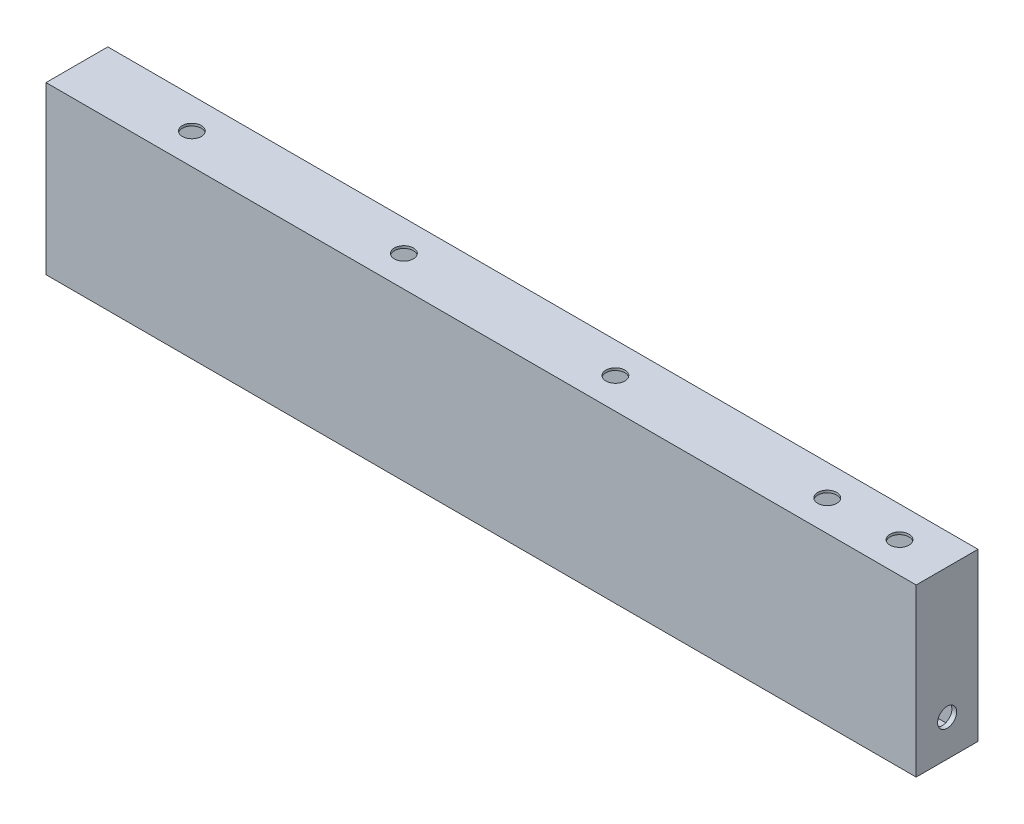
ISO-10303-21;
HEADER;
FILE_DESCRIPTION(('STEP AP214'),'2;1');
FILE_NAME('part.step','',(''),(''),'','','');
FILE_SCHEMA(('AUTOMOTIVE_DESIGN { 1 0 10303 214 1 1 1 1 }'));
ENDSEC;
DATA;
#1=APPLICATION_CONTEXT('core data for automotive mechanical design processes');
#2=APPLICATION_PROTOCOL_DEFINITION('international standard','automotive_design',2000,#1);
#3=PRODUCT_CONTEXT('',#1,'mechanical');
#4=PRODUCT('Part','Part','',(#3));
#5=PRODUCT_RELATED_PRODUCT_CATEGORY('part','',(#4));
#6=PRODUCT_DEFINITION_FORMATION('','',#4);
#7=PRODUCT_DEFINITION_CONTEXT('part definition',#1,'design');
#8=PRODUCT_DEFINITION('design','',#6,#7);
#9=PRODUCT_DEFINITION_SHAPE('','',#8);
#10=(LENGTH_UNIT() NAMED_UNIT(*) SI_UNIT(.MILLI.,.METRE.));
#11=(NAMED_UNIT(*) PLANE_ANGLE_UNIT() SI_UNIT($,.RADIAN.));
#12=(NAMED_UNIT(*) SI_UNIT($,.STERADIAN.) SOLID_ANGLE_UNIT());
#13=UNCERTAINTY_MEASURE_WITH_UNIT(LENGTH_MEASURE(1.E-05),#10,'distance_accuracy_value','');
#14=(GEOMETRIC_REPRESENTATION_CONTEXT(3) GLOBAL_UNCERTAINTY_ASSIGNED_CONTEXT((#13)) GLOBAL_UNIT_ASSIGNED_CONTEXT((#10,
#11,#12)) REPRESENTATION_CONTEXT('',''));
#15=CARTESIAN_POINT('',(0.,0.,0.));
#16=DIRECTION('',(0.,0.,1.));
#17=DIRECTION('',(1.,0.,0.));
#18=AXIS2_PLACEMENT_3D('',#15,#16,#17);
#19=CARTESIAN_POINT('',(905.,175.,-65.));
#20=DIRECTION('',(-1.,0.,0.));
#21=DIRECTION('',(0.,0.,1.));
#22=AXIS2_PLACEMENT_3D('',#19,#20,#21);
#23=PLANE('',#22);
#24=CARTESIAN_POINT('',(905.,-98.5,-0.0999999999999751));
#25=DIRECTION('',(-1.,0.,0.));
#26=DIRECTION('',(0.,0.,1.));
#27=AXIS2_PLACEMENT_3D('',#24,#25,#26);
#28=CIRCLE('',#27,20.);
#29=CARTESIAN_POINT('',(905.,-98.5,19.9));
#30=VERTEX_POINT('',#29);
#31=EDGE_CURVE('E413',#30,#30,#28,.T.);
#32=ORIENTED_EDGE('',*,*,#31,.F.);
#33=EDGE_LOOP('',(#32));
#34=FACE_BOUND('',#33,.T.);
#35=DIRECTION('',(0.,0.,-1.));
#36=VECTOR('',#35,1.);
#37=CARTESIAN_POINT('',(905.,-165.,-65.));
#38=LINE('',#37,#36);
#39=CARTESIAN_POINT('',(905.,-165.,55.));
#40=VERTEX_POINT('',#39);
#41=CARTESIAN_POINT('',(905.,-165.,-55.));
#42=VERTEX_POINT('',#41);
#43=EDGE_CURVE('E169',#40,#42,#38,.T.);
#44=ORIENTED_EDGE('',*,*,#43,.F.);
#45=DIRECTION('',(0.,-1.,0.));
#46=VECTOR('',#45,1.);
#47=CARTESIAN_POINT('',(905.,175.,55.));
#48=LINE('',#47,#46);
#49=CARTESIAN_POINT('',(905.,170.,55.));
#50=VERTEX_POINT('',#49);
#51=EDGE_CURVE('E259',#50,#40,#48,.T.);
#52=ORIENTED_EDGE('',*,*,#51,.F.);
#53=DIRECTION('',(0.,0.,-1.));
#54=VECTOR('',#53,1.);
#55=CARTESIAN_POINT('',(905.,170.,-65.));
#56=LINE('',#55,#54);
#57=CARTESIAN_POINT('',(905.,170.,-55.));
#58=VERTEX_POINT('',#57);
#59=EDGE_CURVE('E238',#50,#58,#56,.T.);
#60=ORIENTED_EDGE('',*,*,#59,.T.);
#61=DIRECTION('',(0.,-1.,0.));
#62=VECTOR('',#61,1.);
#63=CARTESIAN_POINT('',(905.,175.,-55.));
#64=LINE('',#63,#62);
#65=EDGE_CURVE('E254',#58,#42,#64,.T.);
#66=ORIENTED_EDGE('',*,*,#65,.T.);
#67=EDGE_LOOP('',(#44,#52,#60,#66));
#68=FACE_BOUND('',#67,.T.);
#69=ADVANCED_FACE('F42',(#34,#68),#23,.T.);
#70=CARTESIAN_POINT('',(-915.,175.,-55.));
#71=DIRECTION('',(0.,0.,1.));
#72=DIRECTION('',(1.,0.,0.));
#73=AXIS2_PLACEMENT_3D('',#70,#71,#72);
#74=PLANE('',#73);
#75=CARTESIAN_POINT('',(699.9,80.,-55.));
#76=DIRECTION('',(0.,0.,1.));
#77=DIRECTION('',(1.,0.,0.));
#78=AXIS2_PLACEMENT_3D('',#75,#76,#77);
#79=CIRCLE('',#78,22.7500000000003);
#80=CARTESIAN_POINT('',(722.65,80.,-55.));
#81=VERTEX_POINT('',#80);
#82=EDGE_CURVE('E53',#81,#81,#79,.F.);
#83=ORIENTED_EDGE('',*,*,#82,.T.);
#84=EDGE_LOOP('',(#83));
#85=FACE_BOUND('',#84,.T.);
#86=CARTESIAN_POINT('',(619.9,80.,-55.));
#87=DIRECTION('',(0.,0.,1.));
#88=DIRECTION('',(1.,0.,0.));
#89=AXIS2_PLACEMENT_3D('',#86,#87,#88);
#90=CIRCLE('',#89,22.7500000000003);
#91=CARTESIAN_POINT('',(642.650000000001,80.,-55.));
#92=VERTEX_POINT('',#91);
#93=EDGE_CURVE('E178',#92,#92,#90,.F.);
#94=ORIENTED_EDGE('',*,*,#93,.T.);
#95=EDGE_LOOP('',(#94));
#96=FACE_BOUND('',#95,.T.);
#97=CARTESIAN_POINT('',(259.9,80.,-55.));
#98=DIRECTION('',(0.,0.,1.));
#99=DIRECTION('',(1.,0.,0.));
#100=AXIS2_PLACEMENT_3D('',#97,#98,#99);
#101=CIRCLE('',#100,22.75);
#102=CARTESIAN_POINT('',(282.65,80.,-55.));
#103=VERTEX_POINT('',#102);
#104=EDGE_CURVE('E186',#103,#103,#101,.F.);
#105=ORIENTED_EDGE('',*,*,#104,.T.);
#106=EDGE_LOOP('',(#105));
#107=FACE_BOUND('',#106,.T.);
#108=CARTESIAN_POINT('',(179.9,80.,-55.));
#109=DIRECTION('',(0.,0.,1.));
#110=DIRECTION('',(1.,0.,0.));
#111=AXIS2_PLACEMENT_3D('',#108,#109,#110);
#112=CIRCLE('',#111,22.75);
#113=CARTESIAN_POINT('',(202.65,80.,-55.));
#114=VERTEX_POINT('',#113);
#115=EDGE_CURVE('E194',#114,#114,#112,.F.);
#116=ORIENTED_EDGE('',*,*,#115,.T.);
#117=EDGE_LOOP('',(#116));
#118=FACE_BOUND('',#117,.T.);
#119=CARTESIAN_POINT('',(-180.1,80.,-55.));
#120=DIRECTION('',(0.,0.,1.));
#121=DIRECTION('',(1.,0.,0.));
#122=AXIS2_PLACEMENT_3D('',#119,#120,#121);
#123=CIRCLE('',#122,22.75);
#124=CARTESIAN_POINT('',(-157.35,80.,-55.));
#125=VERTEX_POINT('',#124);
#126=EDGE_CURVE('E202',#125,#125,#123,.F.);
#127=ORIENTED_EDGE('',*,*,#126,.T.);
#128=EDGE_LOOP('',(#127));
#129=FACE_BOUND('',#128,.T.);
#130=CARTESIAN_POINT('',(-260.1,80.,-55.));
#131=DIRECTION('',(0.,0.,1.));
#132=DIRECTION('',(1.,0.,0.));
#133=AXIS2_PLACEMENT_3D('',#130,#131,#132);
#134=CIRCLE('',#133,22.75);
#135=CARTESIAN_POINT('',(-237.35,80.,-55.));
#136=VERTEX_POINT('',#135);
#137=EDGE_CURVE('E210',#136,#136,#134,.F.);
#138=ORIENTED_EDGE('',*,*,#137,.T.);
#139=EDGE_LOOP('',(#138));
#140=FACE_BOUND('',#139,.T.);
#141=CARTESIAN_POINT('',(-620.1,80.,-55.));
#142=DIRECTION('',(0.,0.,1.));
#143=DIRECTION('',(1.,0.,0.));
#144=AXIS2_PLACEMENT_3D('',#141,#142,#143);
#145=CIRCLE('',#144,22.75);
#146=CARTESIAN_POINT('',(-597.35,80.,-55.));
#147=VERTEX_POINT('',#146);
#148=EDGE_CURVE('E218',#147,#147,#145,.F.);
#149=ORIENTED_EDGE('',*,*,#148,.T.);
#150=EDGE_LOOP('',(#149));
#151=FACE_BOUND('',#150,.T.);
#152=CARTESIAN_POINT('',(-700.1,80.,-55.));
#153=DIRECTION('',(0.,0.,1.));
#154=DIRECTION('',(1.,0.,0.));
#155=AXIS2_PLACEMENT_3D('',#152,#153,#154);
#156=CIRCLE('',#155,22.75);
#157=CARTESIAN_POINT('',(-677.35,80.,-55.));
#158=VERTEX_POINT('',#157);
#159=EDGE_CURVE('E226',#158,#158,#156,.F.);
#160=ORIENTED_EDGE('',*,*,#159,.T.);
#161=EDGE_LOOP('',(#160));
#162=FACE_BOUND('',#161,.T.);
#163=DIRECTION('',(-1.,0.,0.));
#164=VECTOR('',#163,1.);
#165=CARTESIAN_POINT('',(-915.,-165.,-55.));
#166=LINE('',#165,#164);
#167=CARTESIAN_POINT('',(-905.,-165.,-55.));
#168=VERTEX_POINT('',#167);
#169=EDGE_CURVE('E62',#42,#168,#166,.T.);
#170=ORIENTED_EDGE('',*,*,#169,.F.);
#171=ORIENTED_EDGE('',*,*,#65,.F.);
#172=DIRECTION('',(-1.,0.,0.));
#173=VECTOR('',#172,1.);
#174=CARTESIAN_POINT('',(-915.,170.,-55.));
#175=LINE('',#174,#173);
#176=CARTESIAN_POINT('',(-905.,170.,-55.));
#177=VERTEX_POINT('',#176);
#178=EDGE_CURVE('E86',#58,#177,#175,.T.);
#179=ORIENTED_EDGE('',*,*,#178,.T.);
#180=DIRECTION('',(0.,-1.,0.));
#181=VECTOR('',#180,1.);
#182=CARTESIAN_POINT('',(-905.,175.,-55.));
#183=LINE('',#182,#181);
#184=EDGE_CURVE('E248',#177,#168,#183,.T.);
#185=ORIENTED_EDGE('',*,*,#184,.T.);
#186=EDGE_LOOP('',(#170,#171,#179,#185));
#187=FACE_BOUND('',#186,.T.);
#188=ADVANCED_FACE('F268',(#85,#96,#107,#118,#129,#140,#151,#162,#187),#74,.T.);
#189=CARTESIAN_POINT('',(-905.,175.,-65.));
#190=DIRECTION('',(1.,0.,0.));
#191=DIRECTION('',(0.,0.,-1.));
#192=AXIS2_PLACEMENT_3D('',#189,#190,#191);
#193=PLANE('',#192);
#194=CARTESIAN_POINT('',(-905.,-50.,0.));
#195=DIRECTION('',(1.,0.,0.));
#196=DIRECTION('',(0.,0.,-1.));
#197=AXIS2_PLACEMENT_3D('',#194,#195,#196);
#198=CIRCLE('',#197,20.);
#199=CARTESIAN_POINT('',(-905.,-50.,-20.));
#200=VERTEX_POINT('',#199);
#201=EDGE_CURVE('E458',#200,#200,#198,.T.);
#202=ORIENTED_EDGE('',*,*,#201,.F.);
#203=EDGE_LOOP('',(#202));
#204=FACE_BOUND('',#203,.T.);
#205=DIRECTION('',(0.,0.,1.));
#206=VECTOR('',#205,1.);
#207=CARTESIAN_POINT('',(-905.,-165.,-65.));
#208=LINE('',#207,#206);
#209=CARTESIAN_POINT('',(-905.,-165.,55.));
#210=VERTEX_POINT('',#209);
#211=EDGE_CURVE('E251',#168,#210,#208,.T.);
#212=ORIENTED_EDGE('',*,*,#211,.F.);
#213=ORIENTED_EDGE('',*,*,#184,.F.);
#214=DIRECTION('',(0.,0.,1.));
#215=VECTOR('',#214,1.);
#216=CARTESIAN_POINT('',(-905.,170.,-65.));
#217=LINE('',#216,#215);
#218=CARTESIAN_POINT('',(-905.,170.,55.));
#219=VERTEX_POINT('',#218);
#220=EDGE_CURVE('E233',#177,#219,#217,.T.);
#221=ORIENTED_EDGE('',*,*,#220,.T.);
#222=DIRECTION('',(0.,-1.,0.));
#223=VECTOR('',#222,1.);
#224=CARTESIAN_POINT('',(-905.,175.,55.));
#225=LINE('',#224,#223);
#226=EDGE_CURVE('E241',#219,#210,#225,.T.);
#227=ORIENTED_EDGE('',*,*,#226,.T.);
#228=EDGE_LOOP('',(#212,#213,#221,#227));
#229=FACE_BOUND('',#228,.T.);
#230=ADVANCED_FACE('F272',(#204,#229),#193,.T.);
#231=CARTESIAN_POINT('',(-915.,175.,55.));
#232=DIRECTION('',(0.,0.,-1.));
#233=DIRECTION('',(-1.,0.,0.));
#234=AXIS2_PLACEMENT_3D('',#231,#232,#233);
#235=PLANE('',#234);
#236=DIRECTION('',(1.,0.,0.));
#237=VECTOR('',#236,1.);
#238=CARTESIAN_POINT('',(-915.,-165.,55.));
#239=LINE('',#238,#237);
#240=EDGE_CURVE('E245',#210,#40,#239,.T.);
#241=ORIENTED_EDGE('',*,*,#240,.F.);
#242=ORIENTED_EDGE('',*,*,#226,.F.);
#243=DIRECTION('',(1.,0.,0.));
#244=VECTOR('',#243,1.);
#245=CARTESIAN_POINT('',(-915.,170.,55.));
#246=LINE('',#245,#244);
#247=EDGE_CURVE('E230',#219,#50,#246,.T.);
#248=ORIENTED_EDGE('',*,*,#247,.T.);
#249=ORIENTED_EDGE('',*,*,#51,.T.);
#250=EDGE_LOOP('',(#241,#242,#248,#249));
#251=FACE_BOUND('',#250,.T.);
#252=ADVANCED_FACE('F277',(#251),#235,.T.);
#253=CARTESIAN_POINT('',(0.,170.,0.));
#254=DIRECTION('',(0.,1.,0.));
#255=DIRECTION('',(0.,0.,1.));
#256=AXIS2_PLACEMENT_3D('',#253,#254,#255);
#257=PLANE('',#256);
#258=CARTESIAN_POINT('',(662.9,170.,-0.100000000000182));
#259=DIRECTION('',(0.,1.,0.));
#260=DIRECTION('',(0.,0.,1.));
#261=AXIS2_PLACEMENT_3D('',#258,#259,#260);
#262=CIRCLE('',#261,20.);
#263=CARTESIAN_POINT('',(662.9,170.,19.8999999999998));
#264=VERTEX_POINT('',#263);
#265=EDGE_CURVE('E450',#264,#264,#262,.T.);
#266=ORIENTED_EDGE('',*,*,#265,.T.);
#267=EDGE_LOOP('',(#266));
#268=FACE_BOUND('',#267,.T.);
#269=CARTESIAN_POINT('',(217.3,170.,-0.100000000000128));
#270=DIRECTION('',(0.,1.,0.));
#271=DIRECTION('',(0.,0.,1.));
#272=AXIS2_PLACEMENT_3D('',#269,#270,#271);
#273=CIRCLE('',#272,20.);
#274=CARTESIAN_POINT('',(217.3,170.,19.8999999999999));
#275=VERTEX_POINT('',#274);
#276=EDGE_CURVE('E446',#275,#275,#273,.T.);
#277=ORIENTED_EDGE('',*,*,#276,.T.);
#278=EDGE_LOOP('',(#277));
#279=FACE_BOUND('',#278,.T.);
#280=CARTESIAN_POINT('',(-227.5,170.,-0.100000000000073));
#281=DIRECTION('',(0.,1.,0.));
#282=DIRECTION('',(0.,0.,1.));
#283=AXIS2_PLACEMENT_3D('',#280,#281,#282);
#284=CIRCLE('',#283,20.);
#285=CARTESIAN_POINT('',(-227.5,170.,19.8999999999999));
#286=VERTEX_POINT('',#285);
#287=EDGE_CURVE('E442',#286,#286,#284,.T.);
#288=ORIENTED_EDGE('',*,*,#287,.T.);
#289=EDGE_LOOP('',(#288));
#290=FACE_BOUND('',#289,.T.);
#291=CARTESIAN_POINT('',(-673.4,170.,-0.100000000000019));
#292=DIRECTION('',(0.,1.,0.));
#293=DIRECTION('',(0.,0.,1.));
#294=AXIS2_PLACEMENT_3D('',#291,#292,#293);
#295=CIRCLE('',#294,20.);
#296=CARTESIAN_POINT('',(-673.4,170.,19.8999999999999));
#297=VERTEX_POINT('',#296);
#298=EDGE_CURVE('E427',#297,#297,#295,.T.);
#299=ORIENTED_EDGE('',*,*,#298,.T.);
#300=EDGE_LOOP('',(#299));
#301=FACE_BOUND('',#300,.T.);
#302=CARTESIAN_POINT('',(815.,170.,0.));
#303=DIRECTION('',(0.,1.,0.));
#304=DIRECTION('',(0.,0.,1.));
#305=AXIS2_PLACEMENT_3D('',#302,#303,#304);
#306=CIRCLE('',#305,20.0000000000001);
#307=CARTESIAN_POINT('',(815.,170.,20.0000000000001));
#308=VERTEX_POINT('',#307);
#309=EDGE_CURVE('E46',#308,#308,#306,.T.);
#310=ORIENTED_EDGE('',*,*,#309,.T.);
#311=EDGE_LOOP('',(#310));
#312=FACE_BOUND('',#311,.T.);
#313=ORIENTED_EDGE('',*,*,#59,.F.);
#314=ORIENTED_EDGE('',*,*,#247,.F.);
#315=ORIENTED_EDGE('',*,*,#220,.F.);
#316=ORIENTED_EDGE('',*,*,#178,.F.);
#317=EDGE_LOOP('',(#313,#314,#315,#316));
#318=FACE_BOUND('',#317,.T.);
#319=ADVANCED_FACE('F275',(#268,#279,#290,#301,#312,#318),#257,.F.);
#320=CARTESIAN_POINT('',(0.,-165.,0.));
#321=DIRECTION('',(0.,1.,0.));
#322=DIRECTION('',(0.,0.,1.));
#323=AXIS2_PLACEMENT_3D('',#320,#321,#322);
#324=PLANE('',#323);
#325=ORIENTED_EDGE('',*,*,#43,.T.);
#326=ORIENTED_EDGE('',*,*,#169,.T.);
#327=ORIENTED_EDGE('',*,*,#211,.T.);
#328=ORIENTED_EDGE('',*,*,#240,.T.);
#329=EDGE_LOOP('',(#325,#326,#327,#328));
#330=FACE_BOUND('',#329,.T.);
#331=ADVANCED_FACE('F264',(#330),#324,.T.);
#332=CARTESIAN_POINT('',(-700.1,80.,-0.999999999999987));
#333=DIRECTION('',(0.,0.,-1.));
#334=DIRECTION('',(-1.,0.,0.));
#335=AXIS2_PLACEMENT_3D('',#332,#333,#334);
#336=CYLINDRICAL_SURFACE('',#335,22.75);
#337=CARTESIAN_POINT('',(-700.1,80.,9.00000000000001));
#338=DIRECTION('',(0.,0.,-1.));
#339=DIRECTION('',(-1.,0.,0.));
#340=AXIS2_PLACEMENT_3D('',#337,#338,#339);
#341=CIRCLE('',#340,22.75);
#342=CARTESIAN_POINT('',(-722.85,80.,9.00000000000001));
#343=VERTEX_POINT('',#342);
#344=EDGE_CURVE('E222',#343,#343,#341,.T.);
#345=ORIENTED_EDGE('',*,*,#344,.T.);
#346=EDGE_LOOP('',(#345));
#347=FACE_BOUND('',#346,.T.);
#348=ORIENTED_EDGE('',*,*,#159,.F.);
#349=EDGE_LOOP('',(#348));
#350=FACE_BOUND('',#349,.T.);
#351=ADVANCED_FACE('F821',(#347,#350),#336,.T.);
#352=CARTESIAN_POINT('',(-700.1,80.,9.00000000000001));
#353=DIRECTION('',(0.,0.,-1.));
#354=DIRECTION('',(-1.,0.,0.));
#355=AXIS2_PLACEMENT_3D('',#352,#353,#354);
#356=PLANE('',#355);
#357=ORIENTED_EDGE('',*,*,#344,.F.);
#358=EDGE_LOOP('',(#357));
#359=FACE_BOUND('',#358,.T.);
#360=ADVANCED_FACE('F813',(#359),#356,.F.);
#361=CARTESIAN_POINT('',(-620.1,80.,-0.999999999999987));
#362=DIRECTION('',(0.,0.,-1.));
#363=DIRECTION('',(-1.,0.,0.));
#364=AXIS2_PLACEMENT_3D('',#361,#362,#363);
#365=CYLINDRICAL_SURFACE('',#364,22.75);
#366=CARTESIAN_POINT('',(-620.1,80.,9.00000000000001));
#367=DIRECTION('',(0.,0.,-1.));
#368=DIRECTION('',(-1.,0.,0.));
#369=AXIS2_PLACEMENT_3D('',#366,#367,#368);
#370=CIRCLE('',#369,22.75);
#371=CARTESIAN_POINT('',(-642.85,80.,9.00000000000001));
#372=VERTEX_POINT('',#371);
#373=EDGE_CURVE('E214',#372,#372,#370,.T.);
#374=ORIENTED_EDGE('',*,*,#373,.T.);
#375=EDGE_LOOP('',(#374));
#376=FACE_BOUND('',#375,.T.);
#377=ORIENTED_EDGE('',*,*,#148,.F.);
#378=EDGE_LOOP('',(#377));
#379=FACE_BOUND('',#378,.T.);
#380=ADVANCED_FACE('F805',(#376,#379),#365,.T.);
#381=CARTESIAN_POINT('',(-620.1,80.,9.00000000000001));
#382=DIRECTION('',(0.,0.,-1.));
#383=DIRECTION('',(-1.,0.,0.));
#384=AXIS2_PLACEMENT_3D('',#381,#382,#383);
#385=PLANE('',#384);
#386=ORIENTED_EDGE('',*,*,#373,.F.);
#387=EDGE_LOOP('',(#386));
#388=FACE_BOUND('',#387,.T.);
#389=ADVANCED_FACE('F797',(#388),#385,.F.);
#390=CARTESIAN_POINT('',(-260.1,80.,-0.999999999999987));
#391=DIRECTION('',(0.,0.,-1.));
#392=DIRECTION('',(-1.,0.,0.));
#393=AXIS2_PLACEMENT_3D('',#390,#391,#392);
#394=CYLINDRICAL_SURFACE('',#393,22.75);
#395=CARTESIAN_POINT('',(-260.1,80.,9.00000000000001));
#396=DIRECTION('',(0.,0.,-1.));
#397=DIRECTION('',(-1.,0.,0.));
#398=AXIS2_PLACEMENT_3D('',#395,#396,#397);
#399=CIRCLE('',#398,22.75);
#400=CARTESIAN_POINT('',(-282.85,80.,9.00000000000001));
#401=VERTEX_POINT('',#400);
#402=EDGE_CURVE('E206',#401,#401,#399,.T.);
#403=ORIENTED_EDGE('',*,*,#402,.T.);
#404=EDGE_LOOP('',(#403));
#405=FACE_BOUND('',#404,.T.);
#406=ORIENTED_EDGE('',*,*,#137,.F.);
#407=EDGE_LOOP('',(#406));
#408=FACE_BOUND('',#407,.T.);
#409=ADVANCED_FACE('F789',(#405,#408),#394,.T.);
#410=CARTESIAN_POINT('',(-260.1,80.,9.00000000000001));
#411=DIRECTION('',(0.,0.,-1.));
#412=DIRECTION('',(-1.,0.,0.));
#413=AXIS2_PLACEMENT_3D('',#410,#411,#412);
#414=PLANE('',#413);
#415=ORIENTED_EDGE('',*,*,#402,.F.);
#416=EDGE_LOOP('',(#415));
#417=FACE_BOUND('',#416,.T.);
#418=ADVANCED_FACE('F781',(#417),#414,.F.);
#419=CARTESIAN_POINT('',(-180.1,80.,-0.999999999999987));
#420=DIRECTION('',(0.,0.,-1.));
#421=DIRECTION('',(-1.,0.,0.));
#422=AXIS2_PLACEMENT_3D('',#419,#420,#421);
#423=CYLINDRICAL_SURFACE('',#422,22.75);
#424=CARTESIAN_POINT('',(-180.1,80.,9.00000000000001));
#425=DIRECTION('',(0.,0.,-1.));
#426=DIRECTION('',(-1.,0.,0.));
#427=AXIS2_PLACEMENT_3D('',#424,#425,#426);
#428=CIRCLE('',#427,22.75);
#429=CARTESIAN_POINT('',(-202.85,80.,9.00000000000001));
#430=VERTEX_POINT('',#429);
#431=EDGE_CURVE('E198',#430,#430,#428,.T.);
#432=ORIENTED_EDGE('',*,*,#431,.T.);
#433=EDGE_LOOP('',(#432));
#434=FACE_BOUND('',#433,.T.);
#435=ORIENTED_EDGE('',*,*,#126,.F.);
#436=EDGE_LOOP('',(#435));
#437=FACE_BOUND('',#436,.T.);
#438=ADVANCED_FACE('F773',(#434,#437),#423,.T.);
#439=CARTESIAN_POINT('',(-180.1,80.,9.00000000000001));
#440=DIRECTION('',(0.,0.,-1.));
#441=DIRECTION('',(-1.,0.,0.));
#442=AXIS2_PLACEMENT_3D('',#439,#440,#441);
#443=PLANE('',#442);
#444=ORIENTED_EDGE('',*,*,#431,.F.);
#445=EDGE_LOOP('',(#444));
#446=FACE_BOUND('',#445,.T.);
#447=ADVANCED_FACE('F765',(#446),#443,.F.);
#448=CARTESIAN_POINT('',(179.9,80.,-0.999999999999987));
#449=DIRECTION('',(0.,0.,-1.));
#450=DIRECTION('',(-1.,0.,0.));
#451=AXIS2_PLACEMENT_3D('',#448,#449,#450);
#452=CYLINDRICAL_SURFACE('',#451,22.75);
#453=CARTESIAN_POINT('',(179.9,80.,9.00000000000001));
#454=DIRECTION('',(0.,0.,-1.));
#455=DIRECTION('',(-1.,0.,0.));
#456=AXIS2_PLACEMENT_3D('',#453,#454,#455);
#457=CIRCLE('',#456,22.75);
#458=CARTESIAN_POINT('',(157.15,80.,9.00000000000001));
#459=VERTEX_POINT('',#458);
#460=EDGE_CURVE('E190',#459,#459,#457,.T.);
#461=ORIENTED_EDGE('',*,*,#460,.T.);
#462=EDGE_LOOP('',(#461));
#463=FACE_BOUND('',#462,.T.);
#464=ORIENTED_EDGE('',*,*,#115,.F.);
#465=EDGE_LOOP('',(#464));
#466=FACE_BOUND('',#465,.T.);
#467=ADVANCED_FACE('F757',(#463,#466),#452,.T.);
#468=CARTESIAN_POINT('',(179.9,80.,9.00000000000001));
#469=DIRECTION('',(0.,0.,-1.));
#470=DIRECTION('',(-1.,0.,0.));
#471=AXIS2_PLACEMENT_3D('',#468,#469,#470);
#472=PLANE('',#471);
#473=ORIENTED_EDGE('',*,*,#460,.F.);
#474=EDGE_LOOP('',(#473));
#475=FACE_BOUND('',#474,.T.);
#476=ADVANCED_FACE('F749',(#475),#472,.F.);
#477=CARTESIAN_POINT('',(259.9,80.,-0.999999999999987));
#478=DIRECTION('',(0.,0.,-1.));
#479=DIRECTION('',(-1.,0.,0.));
#480=AXIS2_PLACEMENT_3D('',#477,#478,#479);
#481=CYLINDRICAL_SURFACE('',#480,22.75);
#482=CARTESIAN_POINT('',(259.9,80.,9.00000000000001));
#483=DIRECTION('',(0.,0.,-1.));
#484=DIRECTION('',(-1.,0.,0.));
#485=AXIS2_PLACEMENT_3D('',#482,#483,#484);
#486=CIRCLE('',#485,22.75);
#487=CARTESIAN_POINT('',(237.15,80.,9.00000000000001));
#488=VERTEX_POINT('',#487);
#489=EDGE_CURVE('E182',#488,#488,#486,.T.);
#490=ORIENTED_EDGE('',*,*,#489,.T.);
#491=EDGE_LOOP('',(#490));
#492=FACE_BOUND('',#491,.T.);
#493=ORIENTED_EDGE('',*,*,#104,.F.);
#494=EDGE_LOOP('',(#493));
#495=FACE_BOUND('',#494,.T.);
#496=ADVANCED_FACE('F741',(#492,#495),#481,.T.);
#497=CARTESIAN_POINT('',(259.9,80.,9.00000000000001));
#498=DIRECTION('',(0.,0.,-1.));
#499=DIRECTION('',(-1.,0.,0.));
#500=AXIS2_PLACEMENT_3D('',#497,#498,#499);
#501=PLANE('',#500);
#502=ORIENTED_EDGE('',*,*,#489,.F.);
#503=EDGE_LOOP('',(#502));
#504=FACE_BOUND('',#503,.T.);
#505=ADVANCED_FACE('F733',(#504),#501,.F.);
#506=CARTESIAN_POINT('',(619.9,80.,-0.999999999999987));
#507=DIRECTION('',(0.,0.,-1.));
#508=DIRECTION('',(-1.,0.,0.));
#509=AXIS2_PLACEMENT_3D('',#506,#507,#508);
#510=CYLINDRICAL_SURFACE('',#509,22.7500000000003);
#511=CARTESIAN_POINT('',(619.9,80.,9.00000000000001));
#512=DIRECTION('',(0.,0.,-1.));
#513=DIRECTION('',(-1.,0.,0.));
#514=AXIS2_PLACEMENT_3D('',#511,#512,#513);
#515=CIRCLE('',#514,22.7500000000003);
#516=CARTESIAN_POINT('',(597.15,80.,9.00000000000001));
#517=VERTEX_POINT('',#516);
#518=EDGE_CURVE('E174',#517,#517,#515,.T.);
#519=ORIENTED_EDGE('',*,*,#518,.T.);
#520=EDGE_LOOP('',(#519));
#521=FACE_BOUND('',#520,.T.);
#522=ORIENTED_EDGE('',*,*,#93,.F.);
#523=EDGE_LOOP('',(#522));
#524=FACE_BOUND('',#523,.T.);
#525=ADVANCED_FACE('F725',(#521,#524),#510,.T.);
#526=CARTESIAN_POINT('',(619.9,80.,9.00000000000001));
#527=DIRECTION('',(0.,0.,-1.));
#528=DIRECTION('',(-1.,0.,0.));
#529=AXIS2_PLACEMENT_3D('',#526,#527,#528);
#530=PLANE('',#529);
#531=ORIENTED_EDGE('',*,*,#518,.F.);
#532=EDGE_LOOP('',(#531));
#533=FACE_BOUND('',#532,.T.);
#534=ADVANCED_FACE('F718',(#533),#530,.F.);
#535=CARTESIAN_POINT('',(699.9,80.,-0.999999999999987));
#536=DIRECTION('',(0.,0.,-1.));
#537=DIRECTION('',(-1.,0.,0.));
#538=AXIS2_PLACEMENT_3D('',#535,#536,#537);
#539=CYLINDRICAL_SURFACE('',#538,22.7500000000003);
#540=CARTESIAN_POINT('',(699.9,80.,9.00000000000001));
#541=DIRECTION('',(0.,0.,-1.));
#542=DIRECTION('',(-1.,0.,0.));
#543=AXIS2_PLACEMENT_3D('',#540,#541,#542);
#544=CIRCLE('',#543,22.7500000000003);
#545=CARTESIAN_POINT('',(677.15,80.,9.00000000000001));
#546=VERTEX_POINT('',#545);
#547=EDGE_CURVE('E11',#546,#546,#544,.T.);
#548=ORIENTED_EDGE('',*,*,#547,.T.);
#549=EDGE_LOOP('',(#548));
#550=FACE_BOUND('',#549,.T.);
#551=ORIENTED_EDGE('',*,*,#82,.F.);
#552=EDGE_LOOP('',(#551));
#553=FACE_BOUND('',#552,.T.);
#554=ADVANCED_FACE('F711',(#550,#553),#539,.T.);
#555=CARTESIAN_POINT('',(699.9,80.,9.00000000000001));
#556=DIRECTION('',(0.,0.,-1.));
#557=DIRECTION('',(-1.,0.,0.));
#558=AXIS2_PLACEMENT_3D('',#555,#556,#557);
#559=PLANE('',#558);
#560=ORIENTED_EDGE('',*,*,#547,.F.);
#561=EDGE_LOOP('',(#560));
#562=FACE_BOUND('',#561,.T.);
#563=ADVANCED_FACE('F44',(#562),#559,.F.);
#564=CARTESIAN_POINT('',(815.,111.,0.));
#565=DIRECTION('',(0.,1.,0.));
#566=DIRECTION('',(0.,0.,1.));
#567=AXIS2_PLACEMENT_3D('',#564,#565,#566);
#568=CYLINDRICAL_SURFACE('',#567,20.0000000000001);
#569=CARTESIAN_POINT('',(815.,175.,0.));
#570=DIRECTION('',(0.,1.,0.));
#571=DIRECTION('',(0.,0.,1.));
#572=AXIS2_PLACEMENT_3D('',#569,#570,#571);
#573=CIRCLE('',#572,20.0000000000001);
#574=CARTESIAN_POINT('',(815.,175.,20.0000000000001));
#575=VERTEX_POINT('',#574);
#576=EDGE_CURVE('E462',#575,#575,#573,.T.);
#577=ORIENTED_EDGE('',*,*,#576,.T.);
#578=EDGE_LOOP('',(#577));
#579=FACE_BOUND('',#578,.T.);
#580=ORIENTED_EDGE('',*,*,#309,.F.);
#581=EDGE_LOOP('',(#580));
#582=FACE_BOUND('',#581,.T.);
#583=ADVANCED_FACE('F301',(#579,#582),#568,.F.);
#584=CARTESIAN_POINT('',(915.,175.,-65.));
#585=DIRECTION('',(-1.,0.,0.));
#586=DIRECTION('',(0.,0.,1.));
#587=AXIS2_PLACEMENT_3D('',#584,#585,#586);
#588=PLANE('',#587);
#589=CARTESIAN_POINT('',(915.,-98.5,-0.0999999999999751));
#590=DIRECTION('',(1.,0.,0.));
#591=DIRECTION('',(0.,0.,-1.));
#592=AXIS2_PLACEMENT_3D('',#589,#590,#591);
#593=CIRCLE('',#592,20.);
#594=CARTESIAN_POINT('',(915.,-98.5,-20.1));
#595=VERTEX_POINT('',#594);
#596=EDGE_CURVE('E416',#595,#595,#593,.T.);
#597=ORIENTED_EDGE('',*,*,#596,.F.);
#598=EDGE_LOOP('',(#597));
#599=FACE_BOUND('',#598,.T.);
#600=DIRECTION('',(0.,0.,-1.));
#601=VECTOR('',#600,1.);
#602=CARTESIAN_POINT('',(915.,-175.,-65.));
#603=LINE('',#602,#601);
#604=CARTESIAN_POINT('',(915.,-175.,65.));
#605=VERTEX_POINT('',#604);
#606=CARTESIAN_POINT('',(915.,-175.,-65.));
#607=VERTEX_POINT('',#606);
#608=EDGE_CURVE('E153',#605,#607,#603,.T.);
#609=ORIENTED_EDGE('',*,*,#608,.T.);
#610=DIRECTION('',(0.,-1.,0.));
#611=VECTOR('',#610,1.);
#612=CARTESIAN_POINT('',(915.,175.,-65.));
#613=LINE('',#612,#611);
#614=CARTESIAN_POINT('',(915.,175.,-65.));
#615=VERTEX_POINT('',#614);
#616=EDGE_CURVE('E142',#615,#607,#613,.T.);
#617=ORIENTED_EDGE('',*,*,#616,.F.);
#618=DIRECTION('',(0.,0.,-1.));
#619=VECTOR('',#618,1.);
#620=CARTESIAN_POINT('',(915.,175.,-65.));
#621=LINE('',#620,#619);
#622=CARTESIAN_POINT('',(915.,175.,65.));
#623=VERTEX_POINT('',#622);
#624=EDGE_CURVE('E134',#623,#615,#621,.T.);
#625=ORIENTED_EDGE('',*,*,#624,.F.);
#626=DIRECTION('',(0.,-1.,0.));
#627=VECTOR('',#626,1.);
#628=CARTESIAN_POINT('',(915.,175.,65.));
#629=LINE('',#628,#627);
#630=EDGE_CURVE('E149',#623,#605,#629,.T.);
#631=ORIENTED_EDGE('',*,*,#630,.T.);
#632=EDGE_LOOP('',(#609,#617,#625,#631));
#633=FACE_BOUND('',#632,.T.);
#634=ADVANCED_FACE('F298',(#599,#633),#588,.F.);
#635=CARTESIAN_POINT('',(-915.,175.,-65.));
#636=DIRECTION('',(0.,0.,1.));
#637=DIRECTION('',(1.,0.,0.));
#638=AXIS2_PLACEMENT_3D('',#635,#636,#637);
#639=PLANE('',#638);
#640=CARTESIAN_POINT('',(699.9,80.,-65.));
#641=DIRECTION('',(0.,0.,-1.));
#642=DIRECTION('',(-1.,0.,0.));
#643=AXIS2_PLACEMENT_3D('',#640,#641,#642);
#644=CIRCLE('',#643,12.7500000000003);
#645=CARTESIAN_POINT('',(687.15,80.,-65.));
#646=VERTEX_POINT('',#645);
#647=EDGE_CURVE('E469',#646,#646,#644,.T.);
#648=ORIENTED_EDGE('',*,*,#647,.F.);
#649=EDGE_LOOP('',(#648));
#650=FACE_BOUND('',#649,.T.);
#651=CARTESIAN_POINT('',(619.9,80.,-65.));
#652=DIRECTION('',(0.,0.,-1.));
#653=DIRECTION('',(-1.,0.,0.));
#654=AXIS2_PLACEMENT_3D('',#651,#652,#653);
#655=CIRCLE('',#654,12.7500000000003);
#656=CARTESIAN_POINT('',(607.15,80.,-65.));
#657=VERTEX_POINT('',#656);
#658=EDGE_CURVE('E473',#657,#657,#655,.T.);
#659=ORIENTED_EDGE('',*,*,#658,.F.);
#660=EDGE_LOOP('',(#659));
#661=FACE_BOUND('',#660,.T.);
#662=CARTESIAN_POINT('',(259.9,80.,-65.));
#663=DIRECTION('',(0.,0.,-1.));
#664=DIRECTION('',(-1.,0.,0.));
#665=AXIS2_PLACEMENT_3D('',#662,#663,#664);
#666=CIRCLE('',#665,12.75);
#667=CARTESIAN_POINT('',(247.15,80.,-65.));
#668=VERTEX_POINT('',#667);
#669=EDGE_CURVE('E481',#668,#668,#666,.T.);
#670=ORIENTED_EDGE('',*,*,#669,.F.);
#671=EDGE_LOOP('',(#670));
#672=FACE_BOUND('',#671,.T.);
#673=CARTESIAN_POINT('',(179.9,80.,-65.));
#674=DIRECTION('',(0.,0.,-1.));
#675=DIRECTION('',(-1.,0.,0.));
#676=AXIS2_PLACEMENT_3D('',#673,#674,#675);
#677=CIRCLE('',#676,12.75);
#678=CARTESIAN_POINT('',(167.15,80.,-65.));
#679=VERTEX_POINT('',#678);
#680=EDGE_CURVE('E489',#679,#679,#677,.T.);
#681=ORIENTED_EDGE('',*,*,#680,.F.);
#682=EDGE_LOOP('',(#681));
#683=FACE_BOUND('',#682,.T.);
#684=CARTESIAN_POINT('',(-180.1,80.,-65.));
#685=DIRECTION('',(0.,0.,-1.));
#686=DIRECTION('',(-1.,0.,0.));
#687=AXIS2_PLACEMENT_3D('',#684,#685,#686);
#688=CIRCLE('',#687,12.75);
#689=CARTESIAN_POINT('',(-192.85,80.,-65.));
#690=VERTEX_POINT('',#689);
#691=EDGE_CURVE('E497',#690,#690,#688,.T.);
#692=ORIENTED_EDGE('',*,*,#691,.F.);
#693=EDGE_LOOP('',(#692));
#694=FACE_BOUND('',#693,.T.);
#695=CARTESIAN_POINT('',(-260.1,80.,-65.));
#696=DIRECTION('',(0.,0.,-1.));
#697=DIRECTION('',(-1.,0.,0.));
#698=AXIS2_PLACEMENT_3D('',#695,#696,#697);
#699=CIRCLE('',#698,12.75);
#700=CARTESIAN_POINT('',(-272.85,80.,-65.));
#701=VERTEX_POINT('',#700);
#702=EDGE_CURVE('E505',#701,#701,#699,.T.);
#703=ORIENTED_EDGE('',*,*,#702,.F.);
#704=EDGE_LOOP('',(#703));
#705=FACE_BOUND('',#704,.T.);
#706=CARTESIAN_POINT('',(-620.1,80.,-65.));
#707=DIRECTION('',(0.,0.,-1.));
#708=DIRECTION('',(-1.,0.,0.));
#709=AXIS2_PLACEMENT_3D('',#706,#707,#708);
#710=CIRCLE('',#709,12.75);
#711=CARTESIAN_POINT('',(-632.85,80.,-65.));
#712=VERTEX_POINT('',#711);
#713=EDGE_CURVE('E513',#712,#712,#710,.T.);
#714=ORIENTED_EDGE('',*,*,#713,.F.);
#715=EDGE_LOOP('',(#714));
#716=FACE_BOUND('',#715,.T.);
#717=CARTESIAN_POINT('',(-700.1,80.,-65.));
#718=DIRECTION('',(0.,0.,-1.));
#719=DIRECTION('',(-1.,0.,0.));
#720=AXIS2_PLACEMENT_3D('',#717,#718,#719);
#721=CIRCLE('',#720,12.75);
#722=CARTESIAN_POINT('',(-712.85,80.,-65.));
#723=VERTEX_POINT('',#722);
#724=EDGE_CURVE('E521',#723,#723,#721,.T.);
#725=ORIENTED_EDGE('',*,*,#724,.F.);
#726=EDGE_LOOP('',(#725));
#727=FACE_BOUND('',#726,.T.);
#728=DIRECTION('',(-1.,0.,0.));
#729=VECTOR('',#728,1.);
#730=CARTESIAN_POINT('',(-915.,-175.,-65.));
#731=LINE('',#730,#729);
#732=CARTESIAN_POINT('',(-915.,-175.,-65.));
#733=VERTEX_POINT('',#732);
#734=EDGE_CURVE('E140',#607,#733,#731,.T.);
#735=ORIENTED_EDGE('',*,*,#734,.T.);
#736=DIRECTION('',(0.,-1.,0.));
#737=VECTOR('',#736,1.);
#738=CARTESIAN_POINT('',(-915.,175.,-65.));
#739=LINE('',#738,#737);
#740=CARTESIAN_POINT('',(-915.,175.,-65.));
#741=VERTEX_POINT('',#740);
#742=EDGE_CURVE('E138',#741,#733,#739,.T.);
#743=ORIENTED_EDGE('',*,*,#742,.F.);
#744=DIRECTION('',(-1.,0.,0.));
#745=VECTOR('',#744,1.);
#746=CARTESIAN_POINT('',(-915.,175.,-65.));
#747=LINE('',#746,#745);
#748=EDGE_CURVE('E129',#615,#741,#747,.T.);
#749=ORIENTED_EDGE('',*,*,#748,.F.);
#750=ORIENTED_EDGE('',*,*,#616,.T.);
#751=EDGE_LOOP('',(#735,#743,#749,#750));
#752=FACE_BOUND('',#751,.T.);
#753=ADVANCED_FACE('F139',(#650,#661,#672,#683,#694,#705,#716,#727,#752),#639,.F.);
#754=CARTESIAN_POINT('',(-915.,175.,-65.));
#755=DIRECTION('',(1.,0.,0.));
#756=DIRECTION('',(0.,0.,-1.));
#757=AXIS2_PLACEMENT_3D('',#754,#755,#756);
#758=PLANE('',#757);
#759=CARTESIAN_POINT('',(-915.,-50.,0.));
#760=DIRECTION('',(-1.,0.,0.));
#761=DIRECTION('',(0.,0.,1.));
#762=AXIS2_PLACEMENT_3D('',#759,#760,#761);
#763=CIRCLE('',#762,20.);
#764=CARTESIAN_POINT('',(-915.,-50.,20.));
#765=VERTEX_POINT('',#764);
#766=EDGE_CURVE('E454',#765,#765,#763,.T.);
#767=ORIENTED_EDGE('',*,*,#766,.F.);
#768=EDGE_LOOP('',(#767));
#769=FACE_BOUND('',#768,.T.);
#770=DIRECTION('',(0.,0.,1.));
#771=VECTOR('',#770,1.);
#772=CARTESIAN_POINT('',(-915.,-175.,-65.));
#773=LINE('',#772,#771);
#774=CARTESIAN_POINT('',(-915.,-175.,65.));
#775=VERTEX_POINT('',#774);
#776=EDGE_CURVE('E115',#733,#775,#773,.T.);
#777=ORIENTED_EDGE('',*,*,#776,.T.);
#778=DIRECTION('',(0.,-1.,0.));
#779=VECTOR('',#778,1.);
#780=CARTESIAN_POINT('',(-915.,175.,65.));
#781=LINE('',#780,#779);
#782=CARTESIAN_POINT('',(-915.,175.,65.));
#783=VERTEX_POINT('',#782);
#784=EDGE_CURVE('E143',#783,#775,#781,.T.);
#785=ORIENTED_EDGE('',*,*,#784,.F.);
#786=DIRECTION('',(0.,0.,1.));
#787=VECTOR('',#786,1.);
#788=CARTESIAN_POINT('',(-915.,175.,-65.));
#789=LINE('',#788,#787);
#790=EDGE_CURVE('E132',#741,#783,#789,.T.);
#791=ORIENTED_EDGE('',*,*,#790,.F.);
#792=ORIENTED_EDGE('',*,*,#742,.T.);
#793=EDGE_LOOP('',(#777,#785,#791,#792));
#794=FACE_BOUND('',#793,.T.);
#795=ADVANCED_FACE('F145',(#769,#794),#758,.F.);
#796=CARTESIAN_POINT('',(-915.,175.,65.));
#797=DIRECTION('',(0.,0.,-1.));
#798=DIRECTION('',(-1.,0.,0.));
#799=AXIS2_PLACEMENT_3D('',#796,#797,#798);
#800=PLANE('',#799);
#801=DIRECTION('',(1.,0.,0.));
#802=VECTOR('',#801,1.);
#803=CARTESIAN_POINT('',(-915.,-175.,65.));
#804=LINE('',#803,#802);
#805=EDGE_CURVE('E121',#775,#605,#804,.T.);
#806=ORIENTED_EDGE('',*,*,#805,.T.);
#807=ORIENTED_EDGE('',*,*,#630,.F.);
#808=DIRECTION('',(1.,0.,0.));
#809=VECTOR('',#808,1.);
#810=CARTESIAN_POINT('',(-915.,175.,65.));
#811=LINE('',#810,#809);
#812=EDGE_CURVE('E98',#783,#623,#811,.T.);
#813=ORIENTED_EDGE('',*,*,#812,.F.);
#814=ORIENTED_EDGE('',*,*,#784,.T.);
#815=EDGE_LOOP('',(#806,#807,#813,#814));
#816=FACE_BOUND('',#815,.T.);
#817=ADVANCED_FACE('F308',(#816),#800,.F.);
#818=CARTESIAN_POINT('',(0.,175.,0.));
#819=DIRECTION('',(0.,1.,0.));
#820=DIRECTION('',(0.,0.,1.));
#821=AXIS2_PLACEMENT_3D('',#818,#819,#820);
#822=PLANE('',#821);
#823=CARTESIAN_POINT('',(662.9,175.,-0.100000000000182));
#824=DIRECTION('',(0.,1.,0.));
#825=DIRECTION('',(0.,0.,1.));
#826=AXIS2_PLACEMENT_3D('',#823,#824,#825);
#827=CIRCLE('',#826,20.);
#828=CARTESIAN_POINT('',(662.9,175.,19.8999999999998));
#829=VERTEX_POINT('',#828);
#830=EDGE_CURVE('E423',#829,#829,#827,.T.);
#831=ORIENTED_EDGE('',*,*,#830,.F.);
#832=EDGE_LOOP('',(#831));
#833=FACE_BOUND('',#832,.T.);
#834=CARTESIAN_POINT('',(217.3,175.,-0.100000000000128));
#835=DIRECTION('',(0.,1.,0.));
#836=DIRECTION('',(0.,0.,1.));
#837=AXIS2_PLACEMENT_3D('',#834,#835,#836);
#838=CIRCLE('',#837,20.);
#839=CARTESIAN_POINT('',(217.3,175.,19.8999999999999));
#840=VERTEX_POINT('',#839);
#841=EDGE_CURVE('E428',#840,#840,#838,.T.);
#842=ORIENTED_EDGE('',*,*,#841,.F.);
#843=EDGE_LOOP('',(#842));
#844=FACE_BOUND('',#843,.T.);
#845=CARTESIAN_POINT('',(-227.5,175.,-0.100000000000073));
#846=DIRECTION('',(0.,1.,0.));
#847=DIRECTION('',(0.,0.,1.));
#848=AXIS2_PLACEMENT_3D('',#845,#846,#847);
#849=CIRCLE('',#848,20.);
#850=CARTESIAN_POINT('',(-227.5,175.,19.8999999999999));
#851=VERTEX_POINT('',#850);
#852=EDGE_CURVE('E432',#851,#851,#849,.T.);
#853=ORIENTED_EDGE('',*,*,#852,.F.);
#854=EDGE_LOOP('',(#853));
#855=FACE_BOUND('',#854,.T.);
#856=CARTESIAN_POINT('',(-673.4,175.,-0.100000000000019));
#857=DIRECTION('',(0.,1.,0.));
#858=DIRECTION('',(0.,0.,1.));
#859=AXIS2_PLACEMENT_3D('',#856,#857,#858);
#860=CIRCLE('',#859,20.);
#861=CARTESIAN_POINT('',(-673.4,175.,19.8999999999999));
#862=VERTEX_POINT('',#861);
#863=EDGE_CURVE('E420',#862,#862,#860,.T.);
#864=ORIENTED_EDGE('',*,*,#863,.F.);
#865=EDGE_LOOP('',(#864));
#866=FACE_BOUND('',#865,.T.);
#867=ORIENTED_EDGE('',*,*,#576,.F.);
#868=EDGE_LOOP('',(#867));
#869=FACE_BOUND('',#868,.T.);
#870=ORIENTED_EDGE('',*,*,#624,.T.);
#871=ORIENTED_EDGE('',*,*,#748,.T.);
#872=ORIENTED_EDGE('',*,*,#790,.T.);
#873=ORIENTED_EDGE('',*,*,#812,.T.);
#874=EDGE_LOOP('',(#870,#871,#872,#873));
#875=FACE_BOUND('',#874,.T.);
#876=ADVANCED_FACE('F130',(#833,#844,#855,#866,#869,#875),#822,.T.);
#877=CARTESIAN_POINT('',(0.,-175.,0.));
#878=DIRECTION('',(0.,1.,0.));
#879=DIRECTION('',(0.,0.,1.));
#880=AXIS2_PLACEMENT_3D('',#877,#878,#879);
#881=PLANE('',#880);
#882=ORIENTED_EDGE('',*,*,#608,.F.);
#883=ORIENTED_EDGE('',*,*,#805,.F.);
#884=ORIENTED_EDGE('',*,*,#776,.F.);
#885=ORIENTED_EDGE('',*,*,#734,.F.);
#886=EDGE_LOOP('',(#882,#883,#884,#885));
#887=FACE_BOUND('',#886,.T.);
#888=ADVANCED_FACE('F312',(#887),#881,.F.);
#889=CARTESIAN_POINT('',(-700.1,80.,-0.999999999999987));
#890=DIRECTION('',(0.,0.,-1.));
#891=DIRECTION('',(-1.,0.,0.));
#892=AXIS2_PLACEMENT_3D('',#889,#890,#891);
#893=CYLINDRICAL_SURFACE('',#892,12.75);
#894=CARTESIAN_POINT('',(-700.1,80.,-0.999999999999987));
#895=DIRECTION('',(0.,0.,-1.));
#896=DIRECTION('',(-1.,0.,0.));
#897=AXIS2_PLACEMENT_3D('',#894,#895,#896);
#898=CIRCLE('',#897,12.75);
#899=CARTESIAN_POINT('',(-712.85,80.,-0.999999999999987));
#900=VERTEX_POINT('',#899);
#901=EDGE_CURVE('E525',#900,#900,#898,.T.);
#902=ORIENTED_EDGE('',*,*,#901,.F.);
#903=EDGE_LOOP('',(#902));
#904=FACE_BOUND('',#903,.T.);
#905=ORIENTED_EDGE('',*,*,#724,.T.);
#906=EDGE_LOOP('',(#905));
#907=FACE_BOUND('',#906,.T.);
#908=ADVANCED_FACE('F315',(#904,#907),#893,.F.);
#909=CARTESIAN_POINT('',(-700.1,80.,-0.999999999999987));
#910=DIRECTION('',(0.,0.,-1.));
#911=DIRECTION('',(-1.,0.,0.));
#912=AXIS2_PLACEMENT_3D('',#909,#910,#911);
#913=PLANE('',#912);
#914=ORIENTED_EDGE('',*,*,#901,.T.);
#915=EDGE_LOOP('',(#914));
#916=FACE_BOUND('',#915,.T.);
#917=ADVANCED_FACE('F320',(#916),#913,.T.);
#918=CARTESIAN_POINT('',(-620.1,80.,-0.999999999999987));
#919=DIRECTION('',(0.,0.,-1.));
#920=DIRECTION('',(-1.,0.,0.));
#921=AXIS2_PLACEMENT_3D('',#918,#919,#920);
#922=CYLINDRICAL_SURFACE('',#921,12.75);
#923=CARTESIAN_POINT('',(-620.1,80.,-0.999999999999987));
#924=DIRECTION('',(0.,0.,-1.));
#925=DIRECTION('',(-1.,0.,0.));
#926=AXIS2_PLACEMENT_3D('',#923,#924,#925);
#927=CIRCLE('',#926,12.75);
#928=CARTESIAN_POINT('',(-632.85,80.,-0.999999999999987));
#929=VERTEX_POINT('',#928);
#930=EDGE_CURVE('E517',#929,#929,#927,.T.);
#931=ORIENTED_EDGE('',*,*,#930,.F.);
#932=EDGE_LOOP('',(#931));
#933=FACE_BOUND('',#932,.T.);
#934=ORIENTED_EDGE('',*,*,#713,.T.);
#935=EDGE_LOOP('',(#934));
#936=FACE_BOUND('',#935,.T.);
#937=ADVANCED_FACE('F323',(#933,#936),#922,.F.);
#938=CARTESIAN_POINT('',(-620.1,80.,-0.999999999999987));
#939=DIRECTION('',(0.,0.,-1.));
#940=DIRECTION('',(-1.,0.,0.));
#941=AXIS2_PLACEMENT_3D('',#938,#939,#940);
#942=PLANE('',#941);
#943=ORIENTED_EDGE('',*,*,#930,.T.);
#944=EDGE_LOOP('',(#943));
#945=FACE_BOUND('',#944,.T.);
#946=ADVANCED_FACE('F328',(#945),#942,.T.);
#947=CARTESIAN_POINT('',(-260.1,80.,-0.999999999999987));
#948=DIRECTION('',(0.,0.,-1.));
#949=DIRECTION('',(-1.,0.,0.));
#950=AXIS2_PLACEMENT_3D('',#947,#948,#949);
#951=CYLINDRICAL_SURFACE('',#950,12.75);
#952=CARTESIAN_POINT('',(-260.1,80.,-0.999999999999987));
#953=DIRECTION('',(0.,0.,-1.));
#954=DIRECTION('',(-1.,0.,0.));
#955=AXIS2_PLACEMENT_3D('',#952,#953,#954);
#956=CIRCLE('',#955,12.75);
#957=CARTESIAN_POINT('',(-272.85,80.,-0.999999999999987));
#958=VERTEX_POINT('',#957);
#959=EDGE_CURVE('E509',#958,#958,#956,.T.);
#960=ORIENTED_EDGE('',*,*,#959,.F.);
#961=EDGE_LOOP('',(#960));
#962=FACE_BOUND('',#961,.T.);
#963=ORIENTED_EDGE('',*,*,#702,.T.);
#964=EDGE_LOOP('',(#963));
#965=FACE_BOUND('',#964,.T.);
#966=ADVANCED_FACE('F331',(#962,#965),#951,.F.);
#967=CARTESIAN_POINT('',(-260.1,80.,-0.999999999999987));
#968=DIRECTION('',(0.,0.,-1.));
#969=DIRECTION('',(-1.,0.,0.));
#970=AXIS2_PLACEMENT_3D('',#967,#968,#969);
#971=PLANE('',#970);
#972=ORIENTED_EDGE('',*,*,#959,.T.);
#973=EDGE_LOOP('',(#972));
#974=FACE_BOUND('',#973,.T.);
#975=ADVANCED_FACE('F336',(#974),#971,.T.);
#976=CARTESIAN_POINT('',(-180.1,80.,-0.999999999999987));
#977=DIRECTION('',(0.,0.,-1.));
#978=DIRECTION('',(-1.,0.,0.));
#979=AXIS2_PLACEMENT_3D('',#976,#977,#978);
#980=CYLINDRICAL_SURFACE('',#979,12.75);
#981=CARTESIAN_POINT('',(-180.1,80.,-0.999999999999987));
#982=DIRECTION('',(0.,0.,-1.));
#983=DIRECTION('',(-1.,0.,0.));
#984=AXIS2_PLACEMENT_3D('',#981,#982,#983);
#985=CIRCLE('',#984,12.75);
#986=CARTESIAN_POINT('',(-192.85,80.,-0.999999999999987));
#987=VERTEX_POINT('',#986);
#988=EDGE_CURVE('E501',#987,#987,#985,.T.);
#989=ORIENTED_EDGE('',*,*,#988,.F.);
#990=EDGE_LOOP('',(#989));
#991=FACE_BOUND('',#990,.T.);
#992=ORIENTED_EDGE('',*,*,#691,.T.);
#993=EDGE_LOOP('',(#992));
#994=FACE_BOUND('',#993,.T.);
#995=ADVANCED_FACE('F339',(#991,#994),#980,.F.);
#996=CARTESIAN_POINT('',(-180.1,80.,-0.999999999999987));
#997=DIRECTION('',(0.,0.,-1.));
#998=DIRECTION('',(-1.,0.,0.));
#999=AXIS2_PLACEMENT_3D('',#996,#997,#998);
#1000=PLANE('',#999);
#1001=ORIENTED_EDGE('',*,*,#988,.T.);
#1002=EDGE_LOOP('',(#1001));
#1003=FACE_BOUND('',#1002,.T.);
#1004=ADVANCED_FACE('F344',(#1003),#1000,.T.);
#1005=CARTESIAN_POINT('',(179.9,80.,-0.999999999999987));
#1006=DIRECTION('',(0.,0.,-1.));
#1007=DIRECTION('',(-1.,0.,0.));
#1008=AXIS2_PLACEMENT_3D('',#1005,#1006,#1007);
#1009=CYLINDRICAL_SURFACE('',#1008,12.75);
#1010=CARTESIAN_POINT('',(179.9,80.,-0.999999999999987));
#1011=DIRECTION('',(0.,0.,-1.));
#1012=DIRECTION('',(-1.,0.,0.));
#1013=AXIS2_PLACEMENT_3D('',#1010,#1011,#1012);
#1014=CIRCLE('',#1013,12.75);
#1015=CARTESIAN_POINT('',(167.15,80.,-0.999999999999987));
#1016=VERTEX_POINT('',#1015);
#1017=EDGE_CURVE('E493',#1016,#1016,#1014,.T.);
#1018=ORIENTED_EDGE('',*,*,#1017,.F.);
#1019=EDGE_LOOP('',(#1018));
#1020=FACE_BOUND('',#1019,.T.);
#1021=ORIENTED_EDGE('',*,*,#680,.T.);
#1022=EDGE_LOOP('',(#1021));
#1023=FACE_BOUND('',#1022,.T.);
#1024=ADVANCED_FACE('F347',(#1020,#1023),#1009,.F.);
#1025=CARTESIAN_POINT('',(179.9,80.,-0.999999999999987));
#1026=DIRECTION('',(0.,0.,-1.));
#1027=DIRECTION('',(-1.,0.,0.));
#1028=AXIS2_PLACEMENT_3D('',#1025,#1026,#1027);
#1029=PLANE('',#1028);
#1030=ORIENTED_EDGE('',*,*,#1017,.T.);
#1031=EDGE_LOOP('',(#1030));
#1032=FACE_BOUND('',#1031,.T.);
#1033=ADVANCED_FACE('F352',(#1032),#1029,.T.);
#1034=CARTESIAN_POINT('',(259.9,80.,-0.999999999999987));
#1035=DIRECTION('',(0.,0.,-1.));
#1036=DIRECTION('',(-1.,0.,0.));
#1037=AXIS2_PLACEMENT_3D('',#1034,#1035,#1036);
#1038=CYLINDRICAL_SURFACE('',#1037,12.75);
#1039=CARTESIAN_POINT('',(259.9,80.,-0.999999999999987));
#1040=DIRECTION('',(0.,0.,-1.));
#1041=DIRECTION('',(-1.,0.,0.));
#1042=AXIS2_PLACEMENT_3D('',#1039,#1040,#1041);
#1043=CIRCLE('',#1042,12.75);
#1044=CARTESIAN_POINT('',(247.15,80.,-0.999999999999987));
#1045=VERTEX_POINT('',#1044);
#1046=EDGE_CURVE('E485',#1045,#1045,#1043,.T.);
#1047=ORIENTED_EDGE('',*,*,#1046,.F.);
#1048=EDGE_LOOP('',(#1047));
#1049=FACE_BOUND('',#1048,.T.);
#1050=ORIENTED_EDGE('',*,*,#669,.T.);
#1051=EDGE_LOOP('',(#1050));
#1052=FACE_BOUND('',#1051,.T.);
#1053=ADVANCED_FACE('F355',(#1049,#1052),#1038,.F.);
#1054=CARTESIAN_POINT('',(259.9,80.,-0.999999999999987));
#1055=DIRECTION('',(0.,0.,-1.));
#1056=DIRECTION('',(-1.,0.,0.));
#1057=AXIS2_PLACEMENT_3D('',#1054,#1055,#1056);
#1058=PLANE('',#1057);
#1059=ORIENTED_EDGE('',*,*,#1046,.T.);
#1060=EDGE_LOOP('',(#1059));
#1061=FACE_BOUND('',#1060,.T.);
#1062=ADVANCED_FACE('F360',(#1061),#1058,.T.);
#1063=CARTESIAN_POINT('',(619.9,80.,-0.999999999999987));
#1064=DIRECTION('',(0.,0.,-1.));
#1065=DIRECTION('',(-1.,0.,0.));
#1066=AXIS2_PLACEMENT_3D('',#1063,#1064,#1065);
#1067=CYLINDRICAL_SURFACE('',#1066,12.7500000000003);
#1068=CARTESIAN_POINT('',(619.9,80.,-0.999999999999987));
#1069=DIRECTION('',(0.,0.,-1.));
#1070=DIRECTION('',(-1.,0.,0.));
#1071=AXIS2_PLACEMENT_3D('',#1068,#1069,#1070);
#1072=CIRCLE('',#1071,12.7500000000003);
#1073=CARTESIAN_POINT('',(607.15,80.,-0.999999999999987));
#1074=VERTEX_POINT('',#1073);
#1075=EDGE_CURVE('E477',#1074,#1074,#1072,.T.);
#1076=ORIENTED_EDGE('',*,*,#1075,.F.);
#1077=EDGE_LOOP('',(#1076));
#1078=FACE_BOUND('',#1077,.T.);
#1079=ORIENTED_EDGE('',*,*,#658,.T.);
#1080=EDGE_LOOP('',(#1079));
#1081=FACE_BOUND('',#1080,.T.);
#1082=ADVANCED_FACE('F363',(#1078,#1081),#1067,.F.);
#1083=CARTESIAN_POINT('',(619.9,80.,-0.999999999999987));
#1084=DIRECTION('',(0.,0.,-1.));
#1085=DIRECTION('',(-1.,0.,0.));
#1086=AXIS2_PLACEMENT_3D('',#1083,#1084,#1085);
#1087=PLANE('',#1086);
#1088=ORIENTED_EDGE('',*,*,#1075,.T.);
#1089=EDGE_LOOP('',(#1088));
#1090=FACE_BOUND('',#1089,.T.);
#1091=ADVANCED_FACE('F368',(#1090),#1087,.T.);
#1092=CARTESIAN_POINT('',(699.9,80.,-0.999999999999987));
#1093=DIRECTION('',(0.,0.,-1.));
#1094=DIRECTION('',(-1.,0.,0.));
#1095=AXIS2_PLACEMENT_3D('',#1092,#1093,#1094);
#1096=CYLINDRICAL_SURFACE('',#1095,12.7500000000003);
#1097=CARTESIAN_POINT('',(699.9,80.,-0.999999999999987));
#1098=DIRECTION('',(0.,0.,-1.));
#1099=DIRECTION('',(-1.,0.,0.));
#1100=AXIS2_PLACEMENT_3D('',#1097,#1098,#1099);
#1101=CIRCLE('',#1100,12.7500000000003);
#1102=CARTESIAN_POINT('',(687.15,80.,-0.999999999999987));
#1103=VERTEX_POINT('',#1102);
#1104=EDGE_CURVE('E157',#1103,#1103,#1101,.T.);
#1105=ORIENTED_EDGE('',*,*,#1104,.F.);
#1106=EDGE_LOOP('',(#1105));
#1107=FACE_BOUND('',#1106,.T.);
#1108=ORIENTED_EDGE('',*,*,#647,.T.);
#1109=EDGE_LOOP('',(#1108));
#1110=FACE_BOUND('',#1109,.T.);
#1111=ADVANCED_FACE('F371',(#1107,#1110),#1096,.F.);
#1112=CARTESIAN_POINT('',(699.9,80.,-0.999999999999987));
#1113=DIRECTION('',(0.,0.,-1.));
#1114=DIRECTION('',(-1.,0.,0.));
#1115=AXIS2_PLACEMENT_3D('',#1112,#1113,#1114);
#1116=PLANE('',#1115);
#1117=ORIENTED_EDGE('',*,*,#1104,.T.);
#1118=EDGE_LOOP('',(#1117));
#1119=FACE_BOUND('',#1118,.T.);
#1120=ADVANCED_FACE('F378',(#1119),#1116,.T.);
#1121=CARTESIAN_POINT('',(-876.,-50.,0.));
#1122=DIRECTION('',(-1.,0.,0.));
#1123=DIRECTION('',(0.,0.,1.));
#1124=AXIS2_PLACEMENT_3D('',#1121,#1122,#1123);
#1125=CYLINDRICAL_SURFACE('',#1124,20.);
#1126=ORIENTED_EDGE('',*,*,#201,.T.);
#1127=EDGE_LOOP('',(#1126));
#1128=FACE_BOUND('',#1127,.T.);
#1129=ORIENTED_EDGE('',*,*,#766,.T.);
#1130=EDGE_LOOP('',(#1129));
#1131=FACE_BOUND('',#1130,.T.);
#1132=ADVANCED_FACE('F382',(#1128,#1131),#1125,.F.);
#1133=CARTESIAN_POINT('',(-673.4,125.,-0.100000000000019));
#1134=DIRECTION('',(0.,1.,0.));
#1135=DIRECTION('',(0.,0.,1.));
#1136=AXIS2_PLACEMENT_3D('',#1133,#1134,#1135);
#1137=CYLINDRICAL_SURFACE('',#1136,20.);
#1138=ORIENTED_EDGE('',*,*,#863,.T.);
#1139=EDGE_LOOP('',(#1138));
#1140=FACE_BOUND('',#1139,.T.);
#1141=ORIENTED_EDGE('',*,*,#298,.F.);
#1142=EDGE_LOOP('',(#1141));
#1143=FACE_BOUND('',#1142,.T.);
#1144=ADVANCED_FACE('F389',(#1140,#1143),#1137,.F.);
#1145=CARTESIAN_POINT('',(-227.5,125.,-0.100000000000073));
#1146=DIRECTION('',(0.,1.,0.));
#1147=DIRECTION('',(0.,0.,1.));
#1148=AXIS2_PLACEMENT_3D('',#1145,#1146,#1147);
#1149=CYLINDRICAL_SURFACE('',#1148,20.);
#1150=ORIENTED_EDGE('',*,*,#852,.T.);
#1151=EDGE_LOOP('',(#1150));
#1152=FACE_BOUND('',#1151,.T.);
#1153=ORIENTED_EDGE('',*,*,#287,.F.);
#1154=EDGE_LOOP('',(#1153));
#1155=FACE_BOUND('',#1154,.T.);
#1156=ADVANCED_FACE('F393',(#1152,#1155),#1149,.F.);
#1157=CARTESIAN_POINT('',(217.3,125.,-0.100000000000128));
#1158=DIRECTION('',(0.,1.,0.));
#1159=DIRECTION('',(0.,0.,1.));
#1160=AXIS2_PLACEMENT_3D('',#1157,#1158,#1159);
#1161=CYLINDRICAL_SURFACE('',#1160,20.);
#1162=ORIENTED_EDGE('',*,*,#841,.T.);
#1163=EDGE_LOOP('',(#1162));
#1164=FACE_BOUND('',#1163,.T.);
#1165=ORIENTED_EDGE('',*,*,#276,.F.);
#1166=EDGE_LOOP('',(#1165));
#1167=FACE_BOUND('',#1166,.T.);
#1168=ADVANCED_FACE('F397',(#1164,#1167),#1161,.F.);
#1169=CARTESIAN_POINT('',(662.9,125.,-0.100000000000182));
#1170=DIRECTION('',(0.,1.,0.));
#1171=DIRECTION('',(0.,0.,1.));
#1172=AXIS2_PLACEMENT_3D('',#1169,#1170,#1171);
#1173=CYLINDRICAL_SURFACE('',#1172,20.);
#1174=ORIENTED_EDGE('',*,*,#830,.T.);
#1175=EDGE_LOOP('',(#1174));
#1176=FACE_BOUND('',#1175,.T.);
#1177=ORIENTED_EDGE('',*,*,#265,.F.);
#1178=EDGE_LOOP('',(#1177));
#1179=FACE_BOUND('',#1178,.T.);
#1180=ADVANCED_FACE('F401',(#1176,#1179),#1173,.F.);
#1181=CARTESIAN_POINT('',(865.,-98.5,-0.0999999999999751));
#1182=DIRECTION('',(1.,0.,0.));
#1183=DIRECTION('',(0.,0.,-1.));
#1184=AXIS2_PLACEMENT_3D('',#1181,#1182,#1183);
#1185=CYLINDRICAL_SURFACE('',#1184,20.);
#1186=ORIENTED_EDGE('',*,*,#31,.T.);
#1187=EDGE_LOOP('',(#1186));
#1188=FACE_BOUND('',#1187,.T.);
#1189=ORIENTED_EDGE('',*,*,#596,.T.);
#1190=EDGE_LOOP('',(#1189));
#1191=FACE_BOUND('',#1190,.T.);
#1192=ADVANCED_FACE('F405',(#1188,#1191),#1185,.F.);
#1193=CLOSED_SHELL('',(#69,#188,#230,#252,#319,#331,#351,#360,#380,#389,#409,#418,#438,#447,
#467,#476,#496,#505,#525,#534,#554,#563,#583,#634,#753,#795,#817,#876,#888,#908,#917,#937,#946,
#966,#975,#995,#1004,#1024,#1033,#1053,#1062,#1082,#1091,#1111,#1120,#1132,#1144,#1156,#1168,
#1180,#1192));
#1194=MANIFOLD_SOLID_BREP('B2',#1193);
#1195=ADVANCED_BREP_SHAPE_REPRESENTATION('',(#18,#1194),#14);
#1196=SHAPE_DEFINITION_REPRESENTATION(#9,#1195);
ENDSEC;
END-ISO-10303-21;
